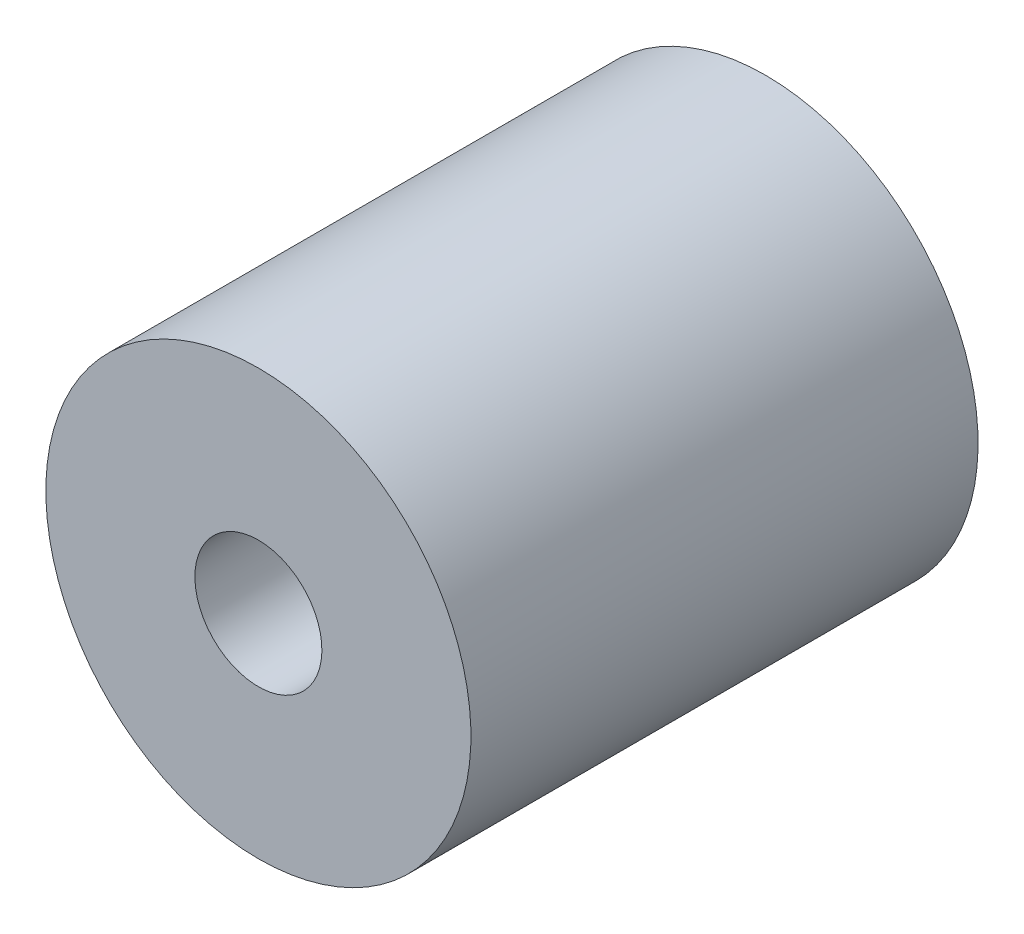
ISO-10303-21;
HEADER;
FILE_DESCRIPTION(('STEP AP214'),'2;1');
FILE_NAME('part.step','',(''),(''),'','','');
FILE_SCHEMA(('AUTOMOTIVE_DESIGN { 1 0 10303 214 1 1 1 1 }'));
ENDSEC;
DATA;
#1=APPLICATION_CONTEXT('core data for automotive mechanical design processes');
#2=APPLICATION_PROTOCOL_DEFINITION('international standard','automotive_design',2000,#1);
#3=PRODUCT_CONTEXT('',#1,'mechanical');
#4=PRODUCT('Part','Part','',(#3));
#5=PRODUCT_RELATED_PRODUCT_CATEGORY('part','',(#4));
#6=PRODUCT_DEFINITION_FORMATION('','',#4);
#7=PRODUCT_DEFINITION_CONTEXT('part definition',#1,'design');
#8=PRODUCT_DEFINITION('design','',#6,#7);
#9=PRODUCT_DEFINITION_SHAPE('','',#8);
#10=(LENGTH_UNIT() NAMED_UNIT(*) SI_UNIT(.MILLI.,.METRE.));
#11=(NAMED_UNIT(*) PLANE_ANGLE_UNIT() SI_UNIT($,.RADIAN.));
#12=(NAMED_UNIT(*) SI_UNIT($,.STERADIAN.) SOLID_ANGLE_UNIT());
#13=UNCERTAINTY_MEASURE_WITH_UNIT(LENGTH_MEASURE(1.E-05),#10,'distance_accuracy_value','');
#14=(GEOMETRIC_REPRESENTATION_CONTEXT(3) GLOBAL_UNCERTAINTY_ASSIGNED_CONTEXT((#13)) GLOBAL_UNIT_ASSIGNED_CONTEXT((#10,
#11,#12)) REPRESENTATION_CONTEXT('',''));
#15=CARTESIAN_POINT('',(0.,0.,0.));
#16=DIRECTION('',(0.,0.,1.));
#17=DIRECTION('',(1.,0.,0.));
#18=AXIS2_PLACEMENT_3D('',#15,#16,#17);
#19=CARTESIAN_POINT('',(0.,0.,-4.429));
#20=DIRECTION('',(0.,0.,-1.));
#21=DIRECTION('',(0.,1.,0.));
#22=AXIS2_PLACEMENT_3D('',#19,#20,#21);
#23=CYLINDRICAL_SURFACE('',#22,0.635);
#24=CARTESIAN_POINT('',(0.,0.,5.071));
#25=DIRECTION('',(0.,0.,-1.));
#26=DIRECTION('',(0.,1.,0.));
#27=AXIS2_PLACEMENT_3D('',#24,#25,#26);
#28=CIRCLE('',#27,0.635);
#29=CARTESIAN_POINT('',(0.,0.634999999999999,5.071));
#30=VERTEX_POINT('',#29);
#31=EDGE_CURVE('E35',#30,#30,#28,.T.);
#32=ORIENTED_EDGE('',*,*,#31,.F.);
#33=EDGE_LOOP('',(#32));
#34=FACE_BOUND('',#33,.T.);
#35=CARTESIAN_POINT('',(0.,0.,-1.52308721190764E-11));
#36=DIRECTION('',(0.,0.,-1.));
#37=DIRECTION('',(-1.,0.,0.));
#38=AXIS2_PLACEMENT_3D('',#35,#36,#37);
#39=CIRCLE('',#38,0.635);
#40=CARTESIAN_POINT('',(-0.635,0.,-1.52308721190764E-11));
#41=VERTEX_POINT('',#40);
#42=EDGE_CURVE('E40',#41,#41,#39,.F.);
#43=ORIENTED_EDGE('',*,*,#42,.F.);
#44=EDGE_LOOP('',(#43));
#45=FACE_BOUND('',#44,.T.);
#46=ADVANCED_FACE('F28',(#34,#45),#23,.F.);
#47=CARTESIAN_POINT('',(0.,0.,-4.429));
#48=DIRECTION('',(0.,0.,-1.));
#49=DIRECTION('',(0.,1.,0.));
#50=AXIS2_PLACEMENT_3D('',#47,#48,#49);
#51=CYLINDRICAL_SURFACE('',#50,2.12525);
#52=CARTESIAN_POINT('',(0.,0.,5.071));
#53=DIRECTION('',(0.,0.,-1.));
#54=DIRECTION('',(0.,1.,0.));
#55=AXIS2_PLACEMENT_3D('',#52,#53,#54);
#56=CIRCLE('',#55,2.12525);
#57=CARTESIAN_POINT('',(0.,2.12525,5.071));
#58=VERTEX_POINT('',#57);
#59=EDGE_CURVE('E10',#58,#58,#56,.T.);
#60=ORIENTED_EDGE('',*,*,#59,.T.);
#61=EDGE_LOOP('',(#60));
#62=FACE_BOUND('',#61,.T.);
#63=CARTESIAN_POINT('',(0.,0.,-1.52308721190764E-11));
#64=DIRECTION('',(0.,0.,-1.));
#65=DIRECTION('',(-1.,0.,0.));
#66=AXIS2_PLACEMENT_3D('',#63,#64,#65);
#67=CIRCLE('',#66,2.12525);
#68=CARTESIAN_POINT('',(-2.12525,0.,-1.52308721190764E-11));
#69=VERTEX_POINT('',#68);
#70=EDGE_CURVE('E31',#69,#69,#67,.F.);
#71=ORIENTED_EDGE('',*,*,#70,.T.);
#72=EDGE_LOOP('',(#71));
#73=FACE_BOUND('',#72,.T.);
#74=ADVANCED_FACE('F48',(#62,#73),#51,.T.);
#75=CARTESIAN_POINT('',(0.,0.,5.071));
#76=DIRECTION('',(0.,0.,1.));
#77=DIRECTION('',(0.,-1.,0.));
#78=AXIS2_PLACEMENT_3D('',#75,#76,#77);
#79=PLANE('',#78);
#80=ORIENTED_EDGE('',*,*,#31,.T.);
#81=EDGE_LOOP('',(#80));
#82=FACE_BOUND('',#81,.T.);
#83=ORIENTED_EDGE('',*,*,#59,.F.);
#84=EDGE_LOOP('',(#83));
#85=FACE_BOUND('',#84,.T.);
#86=ADVANCED_FACE('F52',(#82,#85),#79,.T.);
#87=CARTESIAN_POINT('',(2.49044341434755,10.,-1.52310889595109E-11));
#88=DIRECTION('',(0.,0.,-1.));
#89=DIRECTION('',(-1.,0.,0.));
#90=AXIS2_PLACEMENT_3D('',#87,#88,#89);
#91=PLANE('',#90);
#92=ORIENTED_EDGE('',*,*,#70,.F.);
#93=EDGE_LOOP('',(#92));
#94=FACE_BOUND('',#93,.T.);
#95=ORIENTED_EDGE('',*,*,#42,.T.);
#96=EDGE_LOOP('',(#95));
#97=FACE_BOUND('',#96,.T.);
#98=ADVANCED_FACE('F50',(#94,#97),#91,.T.);
#99=CLOSED_SHELL('',(#46,#74,#86,#98));
#100=MANIFOLD_SOLID_BREP('B2',#99);
#101=ADVANCED_BREP_SHAPE_REPRESENTATION('',(#18,#100),#14);
#102=SHAPE_DEFINITION_REPRESENTATION(#9,#101);
ENDSEC;
END-ISO-10303-21;
